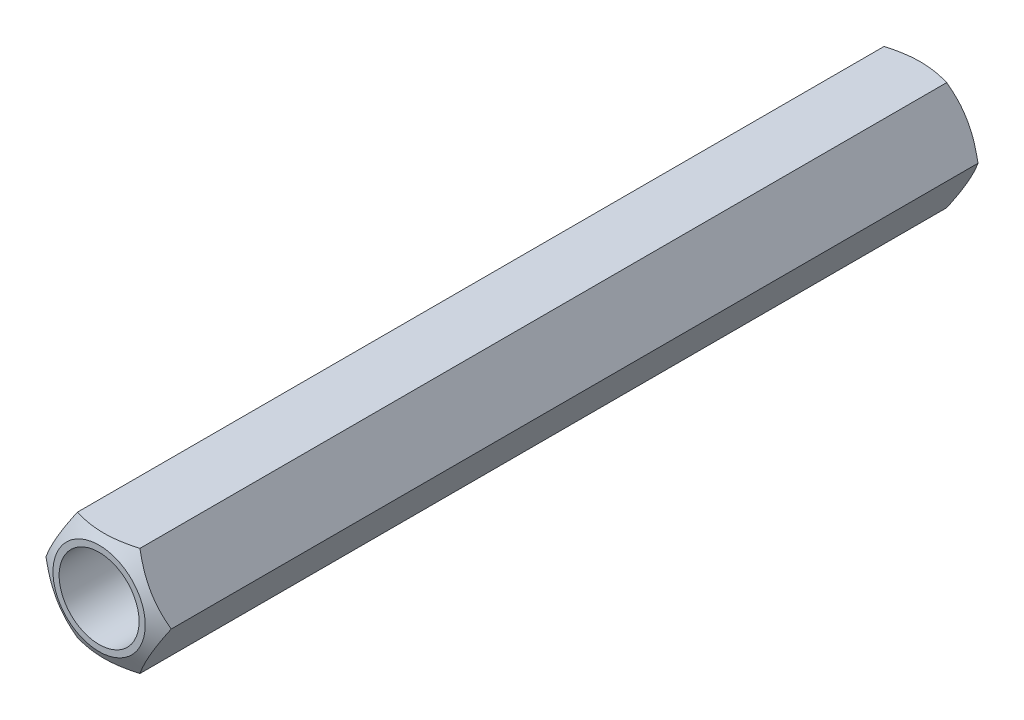
ISO-10303-21;
HEADER;
FILE_DESCRIPTION(('STEP AP214'),'2;1');
FILE_NAME('part.step','',(''),(''),'','','');
FILE_SCHEMA(('AUTOMOTIVE_DESIGN { 1 0 10303 214 1 1 1 1 }'));
ENDSEC;
DATA;
#1=APPLICATION_CONTEXT('core data for automotive mechanical design processes');
#2=APPLICATION_PROTOCOL_DEFINITION('international standard','automotive_design',2000,#1);
#3=PRODUCT_CONTEXT('',#1,'mechanical');
#4=PRODUCT('Part','Part','',(#3));
#5=PRODUCT_RELATED_PRODUCT_CATEGORY('part','',(#4));
#6=PRODUCT_DEFINITION_FORMATION('','',#4);
#7=PRODUCT_DEFINITION_CONTEXT('part definition',#1,'design');
#8=PRODUCT_DEFINITION('design','',#6,#7);
#9=PRODUCT_DEFINITION_SHAPE('','',#8);
#10=(LENGTH_UNIT() NAMED_UNIT(*) SI_UNIT(.MILLI.,.METRE.));
#11=(NAMED_UNIT(*) PLANE_ANGLE_UNIT() SI_UNIT($,.RADIAN.));
#12=(NAMED_UNIT(*) SI_UNIT($,.STERADIAN.) SOLID_ANGLE_UNIT());
#13=UNCERTAINTY_MEASURE_WITH_UNIT(LENGTH_MEASURE(1.E-05),#10,'distance_accuracy_value','');
#14=(GEOMETRIC_REPRESENTATION_CONTEXT(3) GLOBAL_UNCERTAINTY_ASSIGNED_CONTEXT((#13)) GLOBAL_UNIT_ASSIGNED_CONTEXT((#10,
#11,#12)) REPRESENTATION_CONTEXT('',''));
#15=CARTESIAN_POINT('',(0.,0.,0.));
#16=DIRECTION('',(0.,0.,1.));
#17=DIRECTION('',(1.,0.,0.));
#18=AXIS2_PLACEMENT_3D('',#15,#16,#17);
#19=CARTESIAN_POINT('',(0.,0.,31.));
#20=DIRECTION('',(0.,0.,1.));
#21=DIRECTION('',(1.,0.,0.));
#22=AXIS2_PLACEMENT_3D('',#19,#20,#21);
#23=PLANE('',#22);
#24=CARTESIAN_POINT('',(0.,0.,31.));
#25=DIRECTION('',(0.,0.,1.));
#26=DIRECTION('',(1.,0.,0.));
#27=AXIS2_PLACEMENT_3D('',#24,#25,#26);
#28=CIRCLE('',#27,1.5);
#29=CARTESIAN_POINT('',(1.5,0.,31.));
#30=VERTEX_POINT('',#29);
#31=EDGE_CURVE('E231',#30,#30,#28,.T.);
#32=ORIENTED_EDGE('',*,*,#31,.F.);
#33=EDGE_LOOP('',(#32));
#34=FACE_BOUND('',#33,.T.);
#35=CARTESIAN_POINT('',(0.,0.,31.));
#36=DIRECTION('',(0.,0.,1.));
#37=DIRECTION('',(1.,0.,0.));
#38=AXIS2_PLACEMENT_3D('',#35,#36,#37);
#39=CIRCLE('',#38,1.73205080756886);
#40=CARTESIAN_POINT('',(1.73205080756886,0.,31.));
#41=VERTEX_POINT('',#40);
#42=EDGE_CURVE('E118',#41,#41,#39,.F.);
#43=ORIENTED_EDGE('',*,*,#42,.F.);
#44=EDGE_LOOP('',(#43));
#45=FACE_BOUND('',#44,.T.);
#46=ADVANCED_FACE('F54',(#34,#45),#23,.T.);
#47=CARTESIAN_POINT('',(0.,0.,0.));
#48=DIRECTION('',(0.,0.,1.));
#49=DIRECTION('',(1.,0.,0.));
#50=AXIS2_PLACEMENT_3D('',#47,#48,#49);
#51=PLANE('',#50);
#52=CARTESIAN_POINT('',(0.,0.,0.));
#53=DIRECTION('',(0.,0.,1.));
#54=DIRECTION('',(1.,0.,0.));
#55=AXIS2_PLACEMENT_3D('',#52,#53,#54);
#56=CIRCLE('',#55,1.5);
#57=CARTESIAN_POINT('',(1.5,0.,0.));
#58=VERTEX_POINT('',#57);
#59=EDGE_CURVE('E269',#58,#58,#56,.T.);
#60=ORIENTED_EDGE('',*,*,#59,.T.);
#61=EDGE_LOOP('',(#60));
#62=FACE_BOUND('',#61,.T.);
#63=CARTESIAN_POINT('',(0.,0.,0.));
#64=DIRECTION('',(0.,0.,1.));
#65=DIRECTION('',(1.,0.,0.));
#66=AXIS2_PLACEMENT_3D('',#63,#64,#65);
#67=CIRCLE('',#66,1.73205080756886);
#68=CARTESIAN_POINT('',(1.73205080756886,0.,0.));
#69=VERTEX_POINT('',#68);
#70=EDGE_CURVE('E272',#69,#69,#67,.F.);
#71=ORIENTED_EDGE('',*,*,#70,.T.);
#72=EDGE_LOOP('',(#71));
#73=FACE_BOUND('',#72,.T.);
#74=ADVANCED_FACE('F257',(#62,#73),#51,.F.);
#75=CARTESIAN_POINT('',(1.175,-2.03515969889343,31.));
#76=DIRECTION('',(-0.866025403784439,0.499999999999999,0.));
#77=DIRECTION('',(-0.499999999999999,-0.866025403784439,0.));
#78=AXIS2_PLACEMENT_3D('',#75,#76,#77);
#79=PLANE('',#78);
#80=DIRECTION('',(0.,0.,-1.));
#81=VECTOR('',#80,1.);
#82=CARTESIAN_POINT('',(2.35,0.,31.));
#83=LINE('',#82,#81);
#84=CARTESIAN_POINT('',(2.35,0.,30.6432268674044));
#85=VERTEX_POINT('',#84);
#86=CARTESIAN_POINT('',(2.35,0.,0.356773132595634));
#87=VERTEX_POINT('',#86);
#88=EDGE_CURVE('E124',#85,#87,#83,.T.);
#89=ORIENTED_EDGE('',*,*,#88,.F.);
#90=CARTESIAN_POINT('',(2.35011547005384,0.000200000000000434,30.6431601958243));
#91=CARTESIAN_POINT('',(2.2984793873616,-0.0892363187267751,30.6729852942501));
#92=CARTESIAN_POINT('',(2.24639758704351,-0.179444643027371,30.7001104966192));
#93=CARTESIAN_POINT('',(2.14133206603719,-0.361423463534016,30.7474586421103));
#94=CARTESIAN_POINT('',(2.08834647796896,-0.453197194137108,30.7676648337612));
#95=CARTESIAN_POINT('',(1.98303198419037,-0.63560724813502,30.7991198539999));
#96=CARTESIAN_POINT('',(1.9307192858608,-0.726215499522855,30.810578013062));
#97=CARTESIAN_POINT('',(1.8258476400518,-0.907858518337419,30.8242586454905));
#98=CARTESIAN_POINT('',(1.7732890739553,-0.998892625189523,30.826492445513));
#99=CARTESIAN_POINT('',(1.67507381206318,-1.16900644886535,30.8218545292715));
#100=CARTESIAN_POINT('',(1.62940244134637,-1.24811158339818,30.8161215815286));
#101=CARTESIAN_POINT('',(1.53835725987695,-1.40580646348754,30.7979486548651));
#102=CARTESIAN_POINT('',(1.49298376421934,-1.48439566328352,30.7855024632749));
#103=CARTESIAN_POINT('',(1.40175074369061,-1.64241589016727,30.7543868269811));
#104=CARTESIAN_POINT('',(1.35590277051368,-1.72182690913376,30.7355854354951));
#105=CARTESIAN_POINT('',(1.26489078161475,-1.87946429800461,30.6929132404831));
#106=CARTESIAN_POINT('',(1.21972559917134,-1.9576926887297,30.6690524686444));
#107=CARTESIAN_POINT('',(1.17488452994616,-2.03535969889343,30.6431601958243));
#108=B_SPLINE_CURVE_WITH_KNOTS('',3,(#90,#91,#92,#93,#94,#95,#96,#97,#98,#99,#100,#101,#102,
#103,#104,#105,#106,#107),.UNSPECIFIED.,.F.,.F.,(4,2,2,2,2,2,2,2,4),(0.,0.322604918431751,
0.645985456040625,0.961361785082122,1.27635074592414,1.55065702629411,1.82521759589205,
2.10586975684077,2.38597056200365),.UNSPECIFIED.);
#109=CARTESIAN_POINT('',(1.175,-2.03515969889343,30.6432268674044));
#110=VERTEX_POINT('',#109);
#111=EDGE_CURVE('E112',#85,#110,#108,.T.);
#112=ORIENTED_EDGE('',*,*,#111,.T.);
#113=DIRECTION('',(0.,0.,-1.));
#114=VECTOR('',#113,1.);
#115=CARTESIAN_POINT('',(1.175,-2.03515969889343,31.));
#116=LINE('',#115,#114);
#117=CARTESIAN_POINT('',(1.175,-2.03515969889343,0.356773132595635));
#118=VERTEX_POINT('',#117);
#119=EDGE_CURVE('E83',#110,#118,#116,.T.);
#120=ORIENTED_EDGE('',*,*,#119,.T.);
#121=CARTESIAN_POINT('',(1.17488452994616,-2.03535969889343,0.356839804175679));
#122=CARTESIAN_POINT('',(1.2265206126384,-1.94592338016666,0.327014705749918));
#123=CARTESIAN_POINT('',(1.27860241295649,-1.85571505586606,0.299889503380816));
#124=CARTESIAN_POINT('',(1.38366793396281,-1.67373623535942,0.252541357889685));
#125=CARTESIAN_POINT('',(1.43665352203104,-1.58196250475632,0.232335166238845));
#126=CARTESIAN_POINT('',(1.54196801580963,-1.39955245075841,0.200880146000134));
#127=CARTESIAN_POINT('',(1.5942807141392,-1.30894419937058,0.189421986938017));
#128=CARTESIAN_POINT('',(1.6991523599482,-1.12730118055601,0.175741354509481));
#129=CARTESIAN_POINT('',(1.7517109260447,-1.03626707370391,0.173507554486975));
#130=CARTESIAN_POINT('',(1.84992618793682,-0.866153250028083,0.178145470728485));
#131=CARTESIAN_POINT('',(1.89559755865363,-0.787048115495255,0.183878418471439));
#132=CARTESIAN_POINT('',(1.98664274012305,-0.629353235405892,0.202051345134873));
#133=CARTESIAN_POINT('',(2.03201623578065,-0.550764035609908,0.214497536725122));
#134=CARTESIAN_POINT('',(2.12324925630939,-0.392743808726161,0.245613173018903));
#135=CARTESIAN_POINT('',(2.16909722948632,-0.313332789759668,0.264414564504895));
#136=CARTESIAN_POINT('',(2.26010921838525,-0.155695400888821,0.307086759516852));
#137=CARTESIAN_POINT('',(2.30527440082866,-0.0774670101637284,0.330947531355551));
#138=CARTESIAN_POINT('',(2.35011547005384,0.000200000000000554,0.356839804175679));
#139=B_SPLINE_CURVE_WITH_KNOTS('',3,(#121,#122,#123,#124,#125,#126,#127,#128,#129,#130,#131,
#132,#133,#134,#135,#136,#137,#138),.UNSPECIFIED.,.F.,.F.,(4,2,2,2,2,2,2,2,4),(0.,
0.32260491843175,0.645985456040625,0.961361785082122,1.27635074592414,1.55065702629411,
1.82521759589205,2.10586975684077,2.38597056200365),.UNSPECIFIED.);
#140=EDGE_CURVE('E129',#118,#87,#139,.T.);
#141=ORIENTED_EDGE('',*,*,#140,.T.);
#142=EDGE_LOOP('',(#89,#112,#120,#141));
#143=FACE_BOUND('',#142,.T.);
#144=ADVANCED_FACE('F56',(#143),#79,.F.);
#145=CARTESIAN_POINT('',(2.35,0.,31.));
#146=DIRECTION('',(-0.866025403784439,-0.5,0.));
#147=DIRECTION('',(0.5,-0.866025403784439,0.));
#148=AXIS2_PLACEMENT_3D('',#145,#146,#147);
#149=PLANE('',#148);
#150=DIRECTION('',(0.,0.,-1.));
#151=VECTOR('',#150,1.);
#152=CARTESIAN_POINT('',(1.175,2.03515969889343,31.));
#153=LINE('',#152,#151);
#154=CARTESIAN_POINT('',(1.175,2.03515969889343,30.6432268674044));
#155=VERTEX_POINT('',#154);
#156=CARTESIAN_POINT('',(1.175,2.03515969889343,0.356773132595634));
#157=VERTEX_POINT('',#156);
#158=EDGE_CURVE('E126',#155,#157,#153,.T.);
#159=ORIENTED_EDGE('',*,*,#158,.F.);
#160=CARTESIAN_POINT('',(1.17488452994616,2.03535969889343,30.6431601958243));
#161=CARTESIAN_POINT('',(1.22652061263839,1.94592338016666,30.6729852942501));
#162=CARTESIAN_POINT('',(1.27860241295649,1.85571505586606,30.7001104966192));
#163=CARTESIAN_POINT('',(1.38366793396281,1.67373623535941,30.7474586421103));
#164=CARTESIAN_POINT('',(1.43665352203104,1.58196250475632,30.7676648337612));
#165=CARTESIAN_POINT('',(1.54196801580963,1.39955245075841,30.7991198539999));
#166=CARTESIAN_POINT('',(1.5942807141392,1.30894419937058,30.810578013062));
#167=CARTESIAN_POINT('',(1.6991523599482,1.12730118055601,30.8242586454905));
#168=CARTESIAN_POINT('',(1.7517109260447,1.03626707370391,30.826492445513));
#169=CARTESIAN_POINT('',(1.84992618793682,0.866153250028082,30.8218545292715));
#170=CARTESIAN_POINT('',(1.89559755865363,0.787048115495254,30.8161215815286));
#171=CARTESIAN_POINT('',(1.98664274012305,0.629353235405891,30.7979486548651));
#172=CARTESIAN_POINT('',(2.03201623578065,0.550764035609908,30.7855024632749));
#173=CARTESIAN_POINT('',(2.12324925630939,0.392743808726161,30.7543868269811));
#174=CARTESIAN_POINT('',(2.16909722948632,0.313332789759668,30.7355854354951));
#175=CARTESIAN_POINT('',(2.26010921838525,0.155695400888822,30.6929132404831));
#176=CARTESIAN_POINT('',(2.30527440082866,0.0774670101637288,30.6690524686444));
#177=CARTESIAN_POINT('',(2.35011547005384,-0.000199999999999918,30.6431601958243));
#178=B_SPLINE_CURVE_WITH_KNOTS('',3,(#160,#161,#162,#163,#164,#165,#166,#167,#168,#169,#170,
#171,#172,#173,#174,#175,#176,#177),.UNSPECIFIED.,.F.,.F.,(4,2,2,2,2,2,2,2,4),(0.,
0.322604918431751,0.645985456040625,0.961361785082122,1.27635074592414,1.55065702629411,
1.82521759589205,2.10586975684077,2.38597056200365),.UNSPECIFIED.);
#179=EDGE_CURVE('E115',#155,#85,#178,.T.);
#180=ORIENTED_EDGE('',*,*,#179,.T.);
#181=ORIENTED_EDGE('',*,*,#88,.T.);
#182=CARTESIAN_POINT('',(2.35011547005384,-0.000199999999999566,0.356839804175679));
#183=CARTESIAN_POINT('',(2.2984793873616,0.0892363187267756,0.327014705749916));
#184=CARTESIAN_POINT('',(2.24639758704351,0.179444643027371,0.299889503380814));
#185=CARTESIAN_POINT('',(2.14133206603719,0.361423463534017,0.252541357889684));
#186=CARTESIAN_POINT('',(2.08834647796896,0.453197194137109,0.232335166238844));
#187=CARTESIAN_POINT('',(1.98303198419037,0.63560724813502,0.200880146000134));
#188=CARTESIAN_POINT('',(1.9307192858608,0.726215499522856,0.189421986938016));
#189=CARTESIAN_POINT('',(1.8258476400518,0.907858518337419,0.175741354509481));
#190=CARTESIAN_POINT('',(1.7732890739553,0.998892625189523,0.173507554486975));
#191=CARTESIAN_POINT('',(1.67507381206318,1.16900644886535,0.178145470728485));
#192=CARTESIAN_POINT('',(1.62940244134637,1.24811158339818,0.183878418471439));
#193=CARTESIAN_POINT('',(1.53835725987695,1.40580646348754,0.202051345134873));
#194=CARTESIAN_POINT('',(1.49298376421934,1.48439566328352,0.214497536725122));
#195=CARTESIAN_POINT('',(1.40175074369061,1.64241589016727,0.245613173018903));
#196=CARTESIAN_POINT('',(1.35590277051368,1.72182690913376,0.264414564504896));
#197=CARTESIAN_POINT('',(1.26489078161475,1.87946429800461,0.307086759516853));
#198=CARTESIAN_POINT('',(1.21972559917134,1.9576926887297,0.330947531355552));
#199=CARTESIAN_POINT('',(1.17488452994616,2.03535969889343,0.356839804175679));
#200=B_SPLINE_CURVE_WITH_KNOTS('',3,(#182,#183,#184,#185,#186,#187,#188,#189,#190,#191,#192,
#193,#194,#195,#196,#197,#198,#199),.UNSPECIFIED.,.F.,.F.,(4,2,2,2,2,2,2,2,4),(0.,
0.32260491843175,0.645985456040625,0.961361785082122,1.27635074592414,1.55065702629411,
1.82521759589205,2.10586975684077,2.38597056200365),.UNSPECIFIED.);
#201=EDGE_CURVE('E180',#87,#157,#200,.T.);
#202=ORIENTED_EDGE('',*,*,#201,.T.);
#203=EDGE_LOOP('',(#159,#180,#181,#202));
#204=FACE_BOUND('',#203,.T.);
#205=ADVANCED_FACE('F122',(#204),#149,.F.);
#206=CARTESIAN_POINT('',(1.175,2.03515969889343,31.));
#207=DIRECTION('',(0.,-1.,0.));
#208=DIRECTION('',(0.,0.,-1.));
#209=AXIS2_PLACEMENT_3D('',#206,#207,#208);
#210=PLANE('',#209);
#211=DIRECTION('',(0.,0.,-1.));
#212=VECTOR('',#211,1.);
#213=CARTESIAN_POINT('',(-1.175,2.03515969889343,31.));
#214=LINE('',#213,#212);
#215=CARTESIAN_POINT('',(-1.175,2.03515969889343,30.6432268674044));
#216=VERTEX_POINT('',#215);
#217=CARTESIAN_POINT('',(-1.175,2.03515969889343,0.356773132595634));
#218=VERTEX_POINT('',#217);
#219=EDGE_CURVE('E132',#216,#218,#214,.T.);
#220=ORIENTED_EDGE('',*,*,#219,.F.);
#221=CARTESIAN_POINT('',(-3.55212807382598,2.03515969889343,29.6364229895585));
#222=CARTESIAN_POINT('',(-3.467231219555,2.03515969889343,29.6789457863061));
#223=CARTESIAN_POINT('',(-3.38218735213429,2.03515969889343,29.7211781261118));
#224=CARTESIAN_POINT('',(-3.21174137339139,2.03515969889343,29.8049199216354));
#225=CARTESIAN_POINT('',(-3.12633925087882,2.03515969889343,29.846429354561));
#226=CARTESIAN_POINT('',(-2.95494695090238,2.03515969889343,29.9286626827804));
#227=CARTESIAN_POINT('',(-2.8689559397785,2.03515969889343,29.9693848442058));
#228=CARTESIAN_POINT('',(-2.69647511164815,2.03515969889343,30.0497642087398));
#229=CARTESIAN_POINT('',(-2.60998528715122,2.03515969889343,30.0894213958053));
#230=CARTESIAN_POINT('',(-2.43247722602007,2.03515969889343,30.1691919677778));
#231=CARTESIAN_POINT('',(-2.34143153149365,2.03515969889343,30.2092444542354));
#232=CARTESIAN_POINT('',(-2.15856753427552,2.03515969889343,30.287543134664));
#233=CARTESIAN_POINT('',(-2.06674925847243,2.03515969889343,30.3257893911944));
#234=CARTESIAN_POINT('',(-1.88225615012745,2.03515969889343,30.3999603781493));
#235=CARTESIAN_POINT('',(-1.78958203248994,2.03515969889343,30.4358868755508));
#236=CARTESIAN_POINT('',(-1.60311772523511,2.03515969889343,30.5048151850297));
#237=CARTESIAN_POINT('',(-1.50932723392549,2.03515969889343,30.5378161851776));
#238=CARTESIAN_POINT('',(-1.29865551841119,2.03515969889343,30.6072500230001));
#239=CARTESIAN_POINT('',(-1.1814486086403,2.03515969889343,30.6427125951554));
#240=CARTESIAN_POINT('',(-0.94499747792175,2.03515969889343,30.7059183917756));
#241=CARTESIAN_POINT('',(-0.825754492729689,2.03515969889343,30.7336661334005));
#242=CARTESIAN_POINT('',(-0.587339057991055,2.03515969889343,30.7787427670454));
#243=CARTESIAN_POINT('',(-0.468199369521763,2.03515969889343,30.7962395637091));
#244=CARTESIAN_POINT('',(-0.228789198584628,2.03515969889343,30.8195559550923));
#245=CARTESIAN_POINT('',(-0.108519231404826,2.03515969889343,30.8253806340986));
#246=CARTESIAN_POINT('',(0.1327376126842,2.03515969889343,30.8245778091304));
#247=CARTESIAN_POINT('',(0.253724221793553,2.03515969889343,30.8178714558971));
#248=CARTESIAN_POINT('',(0.494483203307689,2.03515969889343,30.7927552437889));
#249=CARTESIAN_POINT('',(0.614254982207438,2.03515969889343,30.7743399202169));
#250=CARTESIAN_POINT('',(0.853895389265485,2.03515969889343,30.727463361611));
#251=CARTESIAN_POINT('',(0.973730246544128,2.03515969889343,30.6988347769264));
#252=CARTESIAN_POINT('',(1.21134369999292,2.03515969889343,30.6339539374632));
#253=CARTESIAN_POINT('',(1.32912107782633,2.03515969889343,30.5976973211126));
#254=CARTESIAN_POINT('',(1.53888373245774,2.03515969889343,30.5275523502834));
#255=CARTESIAN_POINT('',(1.63121997250118,2.03515969889343,30.4946948565768));
#256=CARTESIAN_POINT('',(1.81482042687637,2.03515969889343,30.4261984317087));
#257=CARTESIAN_POINT('',(1.90608493043756,2.03515969889343,30.3905602717803));
#258=CARTESIAN_POINT('',(2.17868410029617,2.03515969889343,30.2803504601926));
#259=CARTESIAN_POINT('',(2.35869909190072,2.03515969889343,30.2025273263047));
#260=CARTESIAN_POINT('',(2.70858785977847,2.03515969889343,30.044923983301));
#261=CARTESIAN_POINT('',(2.87856563694111,2.03515969889343,29.9653705612985));
#262=CARTESIAN_POINT('',(3.13216617732772,2.03515969889343,29.8436016148447));
#263=CARTESIAN_POINT('',(3.2163958374263,2.03515969889343,29.8026439429527));
#264=CARTESIAN_POINT('',(3.38450762339114,2.03515969889343,29.7200269984123));
#265=CARTESIAN_POINT('',(3.46838975905389,2.03515969889343,29.678367745711));
#266=CARTESIAN_POINT('',(3.55212807382598,2.03515969889343,29.6364229895585));
#267=B_SPLINE_CURVE_WITH_KNOTS('',3,(#221,#222,#223,#224,#225,#226,#227,#228,#229,#230,#231,
#232,#233,#234,#235,#236,#237,#238,#239,#240,#241,#242,#243,#244,#245,#246,#247,#248,#249,#250,
#251,#252,#253,#254,#255,#256,#257,#258,#259,#260,#261,#262,#263,#264,#265,#266),.UNSPECIFIED.,
.F.,.F.,(4,2,2,2,2,2,2,2,2,2,2,2,2,2,2,2,2,2,2,2,2,2,4),(0.,0.284854034167145,0.569717033230054,
0.855148786881762,1.14058483795235,1.43896788187757,1.73734058360208,2.03548326430984,
2.33370843286085,2.7008754277329,3.06782698537881,3.42858669368673,3.78918922358478,
4.15206842412695,4.51511710857029,4.88441053752839,5.25391569853288,5.54788939774095,
5.84178184960495,6.42996461167388,6.99294144929101,7.27391803990018,7.55488665532306),.UNSPECIFIED.);
#268=EDGE_CURVE('E127',#216,#155,#267,.T.);
#269=ORIENTED_EDGE('',*,*,#268,.T.);
#270=ORIENTED_EDGE('',*,*,#158,.T.);
#271=CARTESIAN_POINT('',(3.55212807382598,2.03515969889343,1.36357701044152));
#272=CARTESIAN_POINT('',(3.467231219555,2.03515969889343,1.32105421369391));
#273=CARTESIAN_POINT('',(3.38218735213429,2.03515969889343,1.27882187388823));
#274=CARTESIAN_POINT('',(3.21174137339139,2.03515969889343,1.19508007836461));
#275=CARTESIAN_POINT('',(3.12633925087882,2.03515969889343,1.15357064543905));
#276=CARTESIAN_POINT('',(2.95494695090238,2.03515969889343,1.07133731721957));
#277=CARTESIAN_POINT('',(2.8689559397785,2.03515969889343,1.03061515579418));
#278=CARTESIAN_POINT('',(2.69647511164815,2.03515969889343,0.950235791260199));
#279=CARTESIAN_POINT('',(2.60998528715122,2.03515969889343,0.9105786041947));
#280=CARTESIAN_POINT('',(2.43247722602007,2.03515969889343,0.830808032222248));
#281=CARTESIAN_POINT('',(2.34143153149364,2.03515969889343,0.790755545764571));
#282=CARTESIAN_POINT('',(2.15856753427552,2.03515969889343,0.712456865335957));
#283=CARTESIAN_POINT('',(2.06674925847243,2.03515969889343,0.674210608805561));
#284=CARTESIAN_POINT('',(1.88225615012745,2.03515969889343,0.60003962185067));
#285=CARTESIAN_POINT('',(1.78958203248994,2.03515969889343,0.56411312444923));
#286=CARTESIAN_POINT('',(1.60311772523511,2.03515969889343,0.49518481497026));
#287=CARTESIAN_POINT('',(1.50932723392549,2.03515969889343,0.462183814822449));
#288=CARTESIAN_POINT('',(1.29865551841119,2.03515969889343,0.392749976999917));
#289=CARTESIAN_POINT('',(1.1814486086403,2.03515969889343,0.357287404844623));
#290=CARTESIAN_POINT('',(0.944997477921749,2.03515969889343,0.294081608224424));
#291=CARTESIAN_POINT('',(0.825754492729689,2.03515969889343,0.266333866599506));
#292=CARTESIAN_POINT('',(0.587339057991054,2.03515969889343,0.221257232954636));
#293=CARTESIAN_POINT('',(0.468199369521762,2.03515969889343,0.203760436290865));
#294=CARTESIAN_POINT('',(0.228789198584627,2.03515969889343,0.180444044907698));
#295=CARTESIAN_POINT('',(0.108519231404825,2.03515969889343,0.17461936590145));
#296=CARTESIAN_POINT('',(-0.132737612684202,2.03515969889343,0.175422190869629));
#297=CARTESIAN_POINT('',(-0.253724221793555,2.03515969889343,0.182128544102923));
#298=CARTESIAN_POINT('',(-0.494483203307691,2.03515969889343,0.207244756211094));
#299=CARTESIAN_POINT('',(-0.614254982207439,2.03515969889343,0.225660079783118));
#300=CARTESIAN_POINT('',(-0.853895389265486,2.03515969889343,0.272536638388956));
#301=CARTESIAN_POINT('',(-0.973730246544129,2.03515969889343,0.301165223073566));
#302=CARTESIAN_POINT('',(-1.21134369999292,2.03515969889343,0.366046062536759));
#303=CARTESIAN_POINT('',(-1.32912107782633,2.03515969889343,0.402302678887387));
#304=CARTESIAN_POINT('',(-1.53888373245774,2.03515969889343,0.472447649716588));
#305=CARTESIAN_POINT('',(-1.63121997250118,2.03515969889343,0.505305143423232));
#306=CARTESIAN_POINT('',(-1.81482042687637,2.03515969889343,0.5738015682913));
#307=CARTESIAN_POINT('',(-1.90608493043756,2.03515969889343,0.609439728219734));
#308=CARTESIAN_POINT('',(-2.17868410029616,2.03515969889343,0.719649539807435));
#309=CARTESIAN_POINT('',(-2.35869909190072,2.03515969889343,0.797472673695334));
#310=CARTESIAN_POINT('',(-2.70858785977847,2.03515969889343,0.955076016698999));
#311=CARTESIAN_POINT('',(-2.87856563694111,2.03515969889343,1.03462943870146));
#312=CARTESIAN_POINT('',(-3.13216617732772,2.03515969889343,1.15639838515525));
#313=CARTESIAN_POINT('',(-3.2163958374263,2.03515969889343,1.19735605704728));
#314=CARTESIAN_POINT('',(-3.38450762339114,2.03515969889343,1.27997300158771));
#315=CARTESIAN_POINT('',(-3.46838975905389,2.03515969889343,1.32163225428902));
#316=CARTESIAN_POINT('',(-3.55212807382599,2.03515969889343,1.36357701044152));
#317=B_SPLINE_CURVE_WITH_KNOTS('',3,(#271,#272,#273,#274,#275,#276,#277,#278,#279,#280,#281,
#282,#283,#284,#285,#286,#287,#288,#289,#290,#291,#292,#293,#294,#295,#296,#297,#298,#299,#300,
#301,#302,#303,#304,#305,#306,#307,#308,#309,#310,#311,#312,#313,#314,#315,#316),.UNSPECIFIED.,
.F.,.F.,(4,2,2,2,2,2,2,2,2,2,2,2,2,2,2,2,2,2,2,2,2,2,4),(0.,0.284854034167145,0.569717033230055,
0.855148786881763,1.14058483795235,1.43896788187757,1.73734058360209,2.03548326430984,
2.33370843286085,2.7008754277329,3.06782698537881,3.42858669368673,3.78918922358478,
4.15206842412695,4.51511710857029,4.88441053752839,5.25391569853288,5.54788939774095,
5.84178184960495,6.42996461167387,6.992941449291,7.27391803990018,7.55488665532306),.UNSPECIFIED.);
#318=EDGE_CURVE('E173',#157,#218,#317,.T.);
#319=ORIENTED_EDGE('',*,*,#318,.T.);
#320=EDGE_LOOP('',(#220,#269,#270,#319));
#321=FACE_BOUND('',#320,.T.);
#322=ADVANCED_FACE('F192',(#321),#210,.F.);
#323=CARTESIAN_POINT('',(-1.175,2.03515969889343,31.));
#324=DIRECTION('',(0.866025403784439,-0.5,0.));
#325=DIRECTION('',(0.5,0.866025403784439,0.));
#326=AXIS2_PLACEMENT_3D('',#323,#324,#325);
#327=PLANE('',#326);
#328=DIRECTION('',(0.,0.,-1.));
#329=VECTOR('',#328,1.);
#330=CARTESIAN_POINT('',(-2.35,0.,31.));
#331=LINE('',#330,#329);
#332=CARTESIAN_POINT('',(-2.35,0.,30.6432268674044));
#333=VERTEX_POINT('',#332);
#334=CARTESIAN_POINT('',(-2.35,0.,0.356773132595634));
#335=VERTEX_POINT('',#334);
#336=EDGE_CURVE('E228',#333,#335,#331,.T.);
#337=ORIENTED_EDGE('',*,*,#336,.F.);
#338=CARTESIAN_POINT('',(-2.35011547005384,-0.000200000000001301,30.6431601958243));
#339=CARTESIAN_POINT('',(-2.29847938736161,0.0892363187267741,30.6729852942501));
#340=CARTESIAN_POINT('',(-2.24639758704351,0.17944464302737,30.7001104966192));
#341=CARTESIAN_POINT('',(-2.14133206603719,0.361423463534015,30.7474586421103));
#342=CARTESIAN_POINT('',(-2.08834647796896,0.453197194137107,30.7676648337612));
#343=CARTESIAN_POINT('',(-1.98303198419037,0.635607248135019,30.7991198539999));
#344=CARTESIAN_POINT('',(-1.9307192858608,0.726215499522854,30.810578013062));
#345=CARTESIAN_POINT('',(-1.8258476400518,0.907858518337418,30.8242586454905));
#346=CARTESIAN_POINT('',(-1.7732890739553,0.998892625189522,30.826492445513));
#347=CARTESIAN_POINT('',(-1.67507381206318,1.16900644886535,30.8218545292715));
#348=CARTESIAN_POINT('',(-1.62940244134637,1.24811158339818,30.8161215815286));
#349=CARTESIAN_POINT('',(-1.53835725987695,1.40580646348754,30.7979486548651));
#350=CARTESIAN_POINT('',(-1.49298376421935,1.48439566328352,30.7855024632749));
#351=CARTESIAN_POINT('',(-1.40175074369061,1.64241589016727,30.7543868269811));
#352=CARTESIAN_POINT('',(-1.35590277051368,1.72182690913376,30.7355854354951));
#353=CARTESIAN_POINT('',(-1.26489078161475,1.87946429800461,30.6929132404831));
#354=CARTESIAN_POINT('',(-1.21972559917134,1.9576926887297,30.6690524686444));
#355=CARTESIAN_POINT('',(-1.17488452994616,2.03535969889343,30.6431601958243));
#356=B_SPLINE_CURVE_WITH_KNOTS('',3,(#338,#339,#340,#341,#342,#343,#344,#345,#346,#347,#348,
#349,#350,#351,#352,#353,#354,#355),.UNSPECIFIED.,.F.,.F.,(4,2,2,2,2,2,2,2,4),(0.,
0.32260491843175,0.645985456040626,0.961361785082122,1.27635074592414,1.55065702629411,
1.82521759589205,2.10586975684077,2.38597056200365),.UNSPECIFIED.);
#357=EDGE_CURVE('E236',#333,#216,#356,.T.);
#358=ORIENTED_EDGE('',*,*,#357,.T.);
#359=ORIENTED_EDGE('',*,*,#219,.T.);
#360=CARTESIAN_POINT('',(-1.17488452994616,2.03535969889343,0.356839804175679));
#361=CARTESIAN_POINT('',(-1.2265206126384,1.94592338016666,0.327014705749917));
#362=CARTESIAN_POINT('',(-1.27860241295649,1.85571505586606,0.299889503380815));
#363=CARTESIAN_POINT('',(-1.38366793396281,1.67373623535941,0.252541357889684));
#364=CARTESIAN_POINT('',(-1.43665352203104,1.58196250475632,0.232335166238844));
#365=CARTESIAN_POINT('',(-1.54196801580963,1.39955245075841,0.200880146000134));
#366=CARTESIAN_POINT('',(-1.5942807141392,1.30894419937058,0.189421986938017));
#367=CARTESIAN_POINT('',(-1.6991523599482,1.12730118055601,0.175741354509481));
#368=CARTESIAN_POINT('',(-1.7517109260447,1.03626707370391,0.173507554486975));
#369=CARTESIAN_POINT('',(-1.84992618793682,0.866153250028082,0.178145470728485));
#370=CARTESIAN_POINT('',(-1.89559755865363,0.787048115495254,0.183878418471439));
#371=CARTESIAN_POINT('',(-1.98664274012305,0.629353235405891,0.202051345134873));
#372=CARTESIAN_POINT('',(-2.03201623578066,0.550764035609907,0.214497536725123));
#373=CARTESIAN_POINT('',(-2.12324925630939,0.39274380872616,0.245613173018903));
#374=CARTESIAN_POINT('',(-2.16909722948632,0.313332789759667,0.264414564504896));
#375=CARTESIAN_POINT('',(-2.26010921838525,0.155695400888821,0.307086759516853));
#376=CARTESIAN_POINT('',(-2.30527440082866,0.0774670101637276,0.330947531355552));
#377=CARTESIAN_POINT('',(-2.35011547005384,-0.000200000000001378,0.356839804175679));
#378=B_SPLINE_CURVE_WITH_KNOTS('',3,(#360,#361,#362,#363,#364,#365,#366,#367,#368,#369,#370,
#371,#372,#373,#374,#375,#376,#377),.UNSPECIFIED.,.F.,.F.,(4,2,2,2,2,2,2,2,4),(0.,
0.322604918431751,0.645985456040625,0.961361785082122,1.27635074592414,1.55065702629411,
1.82521759589205,2.10586975684077,2.38597056200365),.UNSPECIFIED.);
#379=EDGE_CURVE('E166',#218,#335,#378,.T.);
#380=ORIENTED_EDGE('',*,*,#379,.T.);
#381=EDGE_LOOP('',(#337,#358,#359,#380));
#382=FACE_BOUND('',#381,.T.);
#383=ADVANCED_FACE('F235',(#382),#327,.F.);
#384=CARTESIAN_POINT('',(-2.35,0.,31.));
#385=DIRECTION('',(0.866025403784439,0.5,0.));
#386=DIRECTION('',(-0.5,0.866025403784439,0.));
#387=AXIS2_PLACEMENT_3D('',#384,#385,#386);
#388=PLANE('',#387);
#389=DIRECTION('',(0.,0.,-1.));
#390=VECTOR('',#389,1.);
#391=CARTESIAN_POINT('',(-1.175,-2.03515969889343,31.));
#392=LINE('',#391,#390);
#393=CARTESIAN_POINT('',(-1.175,-2.03515969889343,30.6432268674044));
#394=VERTEX_POINT('',#393);
#395=CARTESIAN_POINT('',(-1.175,-2.03515969889343,0.356773132595634));
#396=VERTEX_POINT('',#395);
#397=EDGE_CURVE('E227',#394,#396,#392,.T.);
#398=ORIENTED_EDGE('',*,*,#397,.F.);
#399=CARTESIAN_POINT('',(-1.17488452994616,-2.03535969889343,30.6431601958243));
#400=CARTESIAN_POINT('',(-1.2265206126384,-1.94592338016666,30.6729852942501));
#401=CARTESIAN_POINT('',(-1.27860241295649,-1.85571505586606,30.7001104966192));
#402=CARTESIAN_POINT('',(-1.38366793396281,-1.67373623535941,30.7474586421103));
#403=CARTESIAN_POINT('',(-1.43665352203104,-1.58196250475632,30.7676648337612));
#404=CARTESIAN_POINT('',(-1.54196801580963,-1.39955245075841,30.7991198539999));
#405=CARTESIAN_POINT('',(-1.5942807141392,-1.30894419937058,30.810578013062));
#406=CARTESIAN_POINT('',(-1.6991523599482,-1.12730118055601,30.8242586454905));
#407=CARTESIAN_POINT('',(-1.7517109260447,-1.03626707370391,30.826492445513));
#408=CARTESIAN_POINT('',(-1.84992618793682,-0.866153250028083,30.8218545292715));
#409=CARTESIAN_POINT('',(-1.89559755865363,-0.787048115495255,30.8161215815286));
#410=CARTESIAN_POINT('',(-1.98664274012305,-0.629353235405892,30.7979486548651));
#411=CARTESIAN_POINT('',(-2.03201623578066,-0.550764035609908,30.7855024632749));
#412=CARTESIAN_POINT('',(-2.12324925630939,-0.392743808726162,30.7543868269811));
#413=CARTESIAN_POINT('',(-2.16909722948632,-0.313332789759669,30.7355854354951));
#414=CARTESIAN_POINT('',(-2.26010921838525,-0.155695400888823,30.6929132404831));
#415=CARTESIAN_POINT('',(-2.30527440082866,-0.0774670101637299,30.6690524686444));
#416=CARTESIAN_POINT('',(-2.35011547005384,0.000199999999998835,30.6431601958243));
#417=B_SPLINE_CURVE_WITH_KNOTS('',3,(#399,#400,#401,#402,#403,#404,#405,#406,#407,#408,#409,
#410,#411,#412,#413,#414,#415,#416),.UNSPECIFIED.,.F.,.F.,(4,2,2,2,2,2,2,2,4),(0.,
0.322604918431751,0.645985456040626,0.961361785082123,1.27635074592414,1.55065702629411,
1.82521759589205,2.10586975684077,2.38597056200365),.UNSPECIFIED.);
#418=EDGE_CURVE('E76',#394,#333,#417,.T.);
#419=ORIENTED_EDGE('',*,*,#418,.T.);
#420=ORIENTED_EDGE('',*,*,#336,.T.);
#421=CARTESIAN_POINT('',(-2.35011547005384,0.000199999999998699,0.356839804175679));
#422=CARTESIAN_POINT('',(-2.29847938736161,-0.0892363187267767,0.327014705749917));
#423=CARTESIAN_POINT('',(-2.24639758704351,-0.179444643027372,0.299889503380815));
#424=CARTESIAN_POINT('',(-2.14133206603719,-0.361423463534018,0.252541357889684));
#425=CARTESIAN_POINT('',(-2.08834647796896,-0.45319719413711,0.232335166238844));
#426=CARTESIAN_POINT('',(-1.98303198419037,-0.635607248135021,0.200880146000134));
#427=CARTESIAN_POINT('',(-1.9307192858608,-0.726215499522857,0.189421986938017));
#428=CARTESIAN_POINT('',(-1.8258476400518,-0.90785851833742,0.175741354509482));
#429=CARTESIAN_POINT('',(-1.7732890739553,-0.998892625189524,0.173507554486976));
#430=CARTESIAN_POINT('',(-1.67507381206318,-1.16900644886535,0.178145470728486));
#431=CARTESIAN_POINT('',(-1.62940244134637,-1.24811158339818,0.18387841847144));
#432=CARTESIAN_POINT('',(-1.53835725987695,-1.40580646348754,0.202051345134874));
#433=CARTESIAN_POINT('',(-1.49298376421935,-1.48439566328352,0.214497536725123));
#434=CARTESIAN_POINT('',(-1.40175074369061,-1.64241589016727,0.245613173018904));
#435=CARTESIAN_POINT('',(-1.35590277051368,-1.72182690913376,0.264414564504896));
#436=CARTESIAN_POINT('',(-1.26489078161475,-1.87946429800461,0.307086759516853));
#437=CARTESIAN_POINT('',(-1.21972559917135,-1.9576926887297,0.330947531355552));
#438=CARTESIAN_POINT('',(-1.17488452994616,-2.03535969889343,0.356839804175679));
#439=B_SPLINE_CURVE_WITH_KNOTS('',3,(#421,#422,#423,#424,#425,#426,#427,#428,#429,#430,#431,
#432,#433,#434,#435,#436,#437,#438),.UNSPECIFIED.,.F.,.F.,(4,2,2,2,2,2,2,2,4),(0.,
0.32260491843175,0.645985456040625,0.961361785082122,1.27635074592414,1.55065702629411,
1.82521759589205,2.10586975684077,2.38597056200364),.UNSPECIFIED.);
#440=EDGE_CURVE('E158',#335,#396,#439,.T.);
#441=ORIENTED_EDGE('',*,*,#440,.T.);
#442=EDGE_LOOP('',(#398,#419,#420,#441));
#443=FACE_BOUND('',#442,.T.);
#444=ADVANCED_FACE('F248',(#443),#388,.F.);
#445=CARTESIAN_POINT('',(-1.175,-2.03515969889343,31.));
#446=DIRECTION('',(0.,1.,0.));
#447=DIRECTION('',(-1.,0.,0.));
#448=AXIS2_PLACEMENT_3D('',#445,#446,#447);
#449=PLANE('',#448);
#450=ORIENTED_EDGE('',*,*,#119,.F.);
#451=CARTESIAN_POINT('',(3.55212807382599,-2.03515969889343,29.6364229895585));
#452=CARTESIAN_POINT('',(3.467231219555,-2.03515969889343,29.6789457863061));
#453=CARTESIAN_POINT('',(3.38218735213429,-2.03515969889343,29.7211781261118));
#454=CARTESIAN_POINT('',(3.21174137339139,-2.03515969889343,29.8049199216354));
#455=CARTESIAN_POINT('',(3.12633925087882,-2.03515969889343,29.846429354561));
#456=CARTESIAN_POINT('',(2.95494695090238,-2.03515969889343,29.9286626827804));
#457=CARTESIAN_POINT('',(2.8689559397785,-2.03515969889343,29.9693848442058));
#458=CARTESIAN_POINT('',(2.69647511164815,-2.03515969889343,30.0497642087398));
#459=CARTESIAN_POINT('',(2.60998528715122,-2.03515969889343,30.0894213958053));
#460=CARTESIAN_POINT('',(2.43247722602007,-2.03515969889343,30.1691919677778));
#461=CARTESIAN_POINT('',(2.34143153149364,-2.03515969889343,30.2092444542354));
#462=CARTESIAN_POINT('',(2.15856753427552,-2.03515969889343,30.287543134664));
#463=CARTESIAN_POINT('',(2.06674925847243,-2.03515969889343,30.3257893911944));
#464=CARTESIAN_POINT('',(1.88225615012745,-2.03515969889343,30.3999603781493));
#465=CARTESIAN_POINT('',(1.78958203248994,-2.03515969889343,30.4358868755508));
#466=CARTESIAN_POINT('',(1.60311772523511,-2.03515969889343,30.5048151850297));
#467=CARTESIAN_POINT('',(1.50932723392549,-2.03515969889343,30.5378161851776));
#468=CARTESIAN_POINT('',(1.29865551841119,-2.03515969889343,30.6072500230001));
#469=CARTESIAN_POINT('',(1.1814486086403,-2.03515969889343,30.6427125951554));
#470=CARTESIAN_POINT('',(0.944997477921749,-2.03515969889343,30.7059183917756));
#471=CARTESIAN_POINT('',(0.825754492729689,-2.03515969889343,30.7336661334005));
#472=CARTESIAN_POINT('',(0.587339057991054,-2.03515969889343,30.7787427670454));
#473=CARTESIAN_POINT('',(0.468199369521761,-2.03515969889343,30.7962395637091));
#474=CARTESIAN_POINT('',(0.228789198584626,-2.03515969889343,30.8195559550923));
#475=CARTESIAN_POINT('',(0.108519231404824,-2.03515969889343,30.8253806340985));
#476=CARTESIAN_POINT('',(-0.132737612684203,-2.03515969889343,30.8245778091304));
#477=CARTESIAN_POINT('',(-0.253724221793556,-2.03515969889343,30.8178714558971));
#478=CARTESIAN_POINT('',(-0.494483203307692,-2.03515969889343,30.7927552437889));
#479=CARTESIAN_POINT('',(-0.614254982207441,-2.03515969889343,30.7743399202169));
#480=CARTESIAN_POINT('',(-0.853895389265488,-2.03515969889343,30.727463361611));
#481=CARTESIAN_POINT('',(-0.973730246544131,-2.03515969889343,30.6988347769264));
#482=CARTESIAN_POINT('',(-1.21134369999292,-2.03515969889343,30.6339539374632));
#483=CARTESIAN_POINT('',(-1.32912107782634,-2.03515969889343,30.5976973211126));
#484=CARTESIAN_POINT('',(-1.53888373245774,-2.03515969889343,30.5275523502834));
#485=CARTESIAN_POINT('',(-1.63121997250118,-2.03515969889343,30.4946948565768));
#486=CARTESIAN_POINT('',(-1.81482042687638,-2.03515969889343,30.4261984317087));
#487=CARTESIAN_POINT('',(-1.90608493043756,-2.03515969889343,30.3905602717803));
#488=CARTESIAN_POINT('',(-2.17868410029617,-2.03515969889343,30.2803504601926));
#489=CARTESIAN_POINT('',(-2.35869909190072,-2.03515969889343,30.2025273263047));
#490=CARTESIAN_POINT('',(-2.70858785977847,-2.03515969889343,30.044923983301));
#491=CARTESIAN_POINT('',(-2.87856563694111,-2.03515969889343,29.9653705612985));
#492=CARTESIAN_POINT('',(-3.13216617732772,-2.03515969889343,29.8436016148447));
#493=CARTESIAN_POINT('',(-3.2163958374263,-2.03515969889343,29.8026439429527));
#494=CARTESIAN_POINT('',(-3.38450762339114,-2.03515969889343,29.7200269984123));
#495=CARTESIAN_POINT('',(-3.46838975905389,-2.03515969889343,29.678367745711));
#496=CARTESIAN_POINT('',(-3.55212807382599,-2.03515969889343,29.6364229895585));
#497=B_SPLINE_CURVE_WITH_KNOTS('',3,(#451,#452,#453,#454,#455,#456,#457,#458,#459,#460,#461,
#462,#463,#464,#465,#466,#467,#468,#469,#470,#471,#472,#473,#474,#475,#476,#477,#478,#479,#480,
#481,#482,#483,#484,#485,#486,#487,#488,#489,#490,#491,#492,#493,#494,#495,#496),.UNSPECIFIED.,
.F.,.F.,(4,2,2,2,2,2,2,2,2,2,2,2,2,2,2,2,2,2,2,2,2,2,4),(0.,0.284854034167147,0.569717033230058,
0.855148786881766,1.14058483795235,1.43896788187757,1.73734058360209,2.03548326430985,
2.33370843286085,2.7008754277329,3.06782698537881,3.42858669368673,3.78918922358478,
4.15206842412696,4.51511710857029,4.88441053752839,5.25391569853288,5.54788939774095,
5.84178184960495,6.42996461167388,6.992941449291,7.27391803990018,7.55488665532306),.UNSPECIFIED.);
#498=EDGE_CURVE('E12',#110,#394,#497,.T.);
#499=ORIENTED_EDGE('',*,*,#498,.T.);
#500=ORIENTED_EDGE('',*,*,#397,.T.);
#501=CARTESIAN_POINT('',(-3.55212807382599,-2.03515969889343,1.36357701044152));
#502=CARTESIAN_POINT('',(-3.467231219555,-2.03515969889343,1.32105421369391));
#503=CARTESIAN_POINT('',(-3.38218735213429,-2.03515969889343,1.27882187388823));
#504=CARTESIAN_POINT('',(-3.21174137339139,-2.03515969889343,1.19508007836462));
#505=CARTESIAN_POINT('',(-3.12633925087882,-2.03515969889343,1.15357064543905));
#506=CARTESIAN_POINT('',(-2.95494695090238,-2.03515969889343,1.07133731721957));
#507=CARTESIAN_POINT('',(-2.8689559397785,-2.03515969889343,1.03061515579418));
#508=CARTESIAN_POINT('',(-2.69647511164815,-2.03515969889343,0.950235791260201));
#509=CARTESIAN_POINT('',(-2.60998528715122,-2.03515969889343,0.910578604194701));
#510=CARTESIAN_POINT('',(-2.43247722602007,-2.03515969889343,0.83080803222225));
#511=CARTESIAN_POINT('',(-2.34143153149365,-2.03515969889343,0.790755545764572));
#512=CARTESIAN_POINT('',(-2.15856753427552,-2.03515969889343,0.712456865335958));
#513=CARTESIAN_POINT('',(-2.06674925847243,-2.03515969889343,0.674210608805562));
#514=CARTESIAN_POINT('',(-1.88225615012745,-2.03515969889343,0.600039621850671));
#515=CARTESIAN_POINT('',(-1.78958203248994,-2.03515969889343,0.564113124449231));
#516=CARTESIAN_POINT('',(-1.60311772523511,-2.03515969889343,0.495184814970261));
#517=CARTESIAN_POINT('',(-1.50932723392549,-2.03515969889343,0.46218381482245));
#518=CARTESIAN_POINT('',(-1.29865551841119,-2.03515969889343,0.392749976999918));
#519=CARTESIAN_POINT('',(-1.1814486086403,-2.03515969889343,0.357287404844624));
#520=CARTESIAN_POINT('',(-0.944997477921751,-2.03515969889343,0.294081608224424));
#521=CARTESIAN_POINT('',(-0.825754492729691,-2.03515969889343,0.266333866599507));
#522=CARTESIAN_POINT('',(-0.587339057991056,-2.03515969889343,0.221257232954636));
#523=CARTESIAN_POINT('',(-0.468199369521764,-2.03515969889343,0.203760436290865));
#524=CARTESIAN_POINT('',(-0.228789198584629,-2.03515969889343,0.180444044907699));
#525=CARTESIAN_POINT('',(-0.108519231404827,-2.03515969889343,0.174619365901451));
#526=CARTESIAN_POINT('',(0.132737612684199,-2.03515969889343,0.17542219086963));
#527=CARTESIAN_POINT('',(0.253724221793553,-2.03515969889343,0.182128544102923));
#528=CARTESIAN_POINT('',(0.494483203307688,-2.03515969889343,0.207244756211094));
#529=CARTESIAN_POINT('',(0.614254982207437,-2.03515969889343,0.225660079783118));
#530=CARTESIAN_POINT('',(0.853895389265484,-2.03515969889343,0.272536638388956));
#531=CARTESIAN_POINT('',(0.973730246544127,-2.03515969889343,0.301165223073566));
#532=CARTESIAN_POINT('',(1.21134369999292,-2.03515969889343,0.366046062536758));
#533=CARTESIAN_POINT('',(1.32912107782633,-2.03515969889343,0.402302678887387));
#534=CARTESIAN_POINT('',(1.53888373245773,-2.03515969889343,0.472447649716588));
#535=CARTESIAN_POINT('',(1.63121997250118,-2.03515969889343,0.505305143423231));
#536=CARTESIAN_POINT('',(1.81482042687637,-2.03515969889343,0.5738015682913));
#537=CARTESIAN_POINT('',(1.90608493043756,-2.03515969889343,0.609439728219734));
#538=CARTESIAN_POINT('',(2.17868410029616,-2.03515969889343,0.719649539807435));
#539=CARTESIAN_POINT('',(2.35869909190072,-2.03515969889343,0.797472673695334));
#540=CARTESIAN_POINT('',(2.70858785977847,-2.03515969889343,0.955076016699));
#541=CARTESIAN_POINT('',(2.87856563694111,-2.03515969889343,1.03462943870146));
#542=CARTESIAN_POINT('',(3.13216617732772,-2.03515969889343,1.15639838515525));
#543=CARTESIAN_POINT('',(3.2163958374263,-2.03515969889343,1.19735605704728));
#544=CARTESIAN_POINT('',(3.38450762339114,-2.03515969889343,1.27997300158771));
#545=CARTESIAN_POINT('',(3.46838975905389,-2.03515969889343,1.32163225428902));
#546=CARTESIAN_POINT('',(3.55212807382599,-2.03515969889343,1.36357701044152));
#547=B_SPLINE_CURVE_WITH_KNOTS('',3,(#501,#502,#503,#504,#505,#506,#507,#508,#509,#510,#511,
#512,#513,#514,#515,#516,#517,#518,#519,#520,#521,#522,#523,#524,#525,#526,#527,#528,#529,#530,
#531,#532,#533,#534,#535,#536,#537,#538,#539,#540,#541,#542,#543,#544,#545,#546),.UNSPECIFIED.,
.F.,.F.,(4,2,2,2,2,2,2,2,2,2,2,2,2,2,2,2,2,2,2,2,2,2,4),(0.,0.284854034167145,0.569717033230055,
0.855148786881762,1.14058483795235,1.43896788187757,1.73734058360209,2.03548326430984,
2.33370843286085,2.7008754277329,3.06782698537881,3.42858669368673,3.78918922358478,
4.15206842412695,4.51511710857029,4.88441053752838,5.25391569853288,5.54788939774095,
5.84178184960495,6.42996461167388,6.99294144929101,7.27391803990018,7.55488665532306),.UNSPECIFIED.);
#548=EDGE_CURVE('E69',#396,#118,#547,.T.);
#549=ORIENTED_EDGE('',*,*,#548,.T.);
#550=EDGE_LOOP('',(#450,#499,#500,#549));
#551=FACE_BOUND('',#550,.T.);
#552=ADVANCED_FACE('F140',(#551),#449,.F.);
#553=CARTESIAN_POINT('',(0.,0.,31.));
#554=DIRECTION('',(0.,0.,-1.));
#555=DIRECTION('',(-1.,0.,0.));
#556=AXIS2_PLACEMENT_3D('',#553,#554,#555);
#557=CYLINDRICAL_SURFACE('',#556,1.5);
#558=ORIENTED_EDGE('',*,*,#31,.T.);
#559=EDGE_LOOP('',(#558));
#560=FACE_BOUND('',#559,.T.);
#561=ORIENTED_EDGE('',*,*,#59,.F.);
#562=EDGE_LOOP('',(#561));
#563=FACE_BOUND('',#562,.T.);
#564=ADVANCED_FACE('F148',(#560,#563),#557,.F.);
#565=CARTESIAN_POINT('',(0.,0.,-1.));
#566=DIRECTION('',(0.,0.,1.));
#567=DIRECTION('',(1.,0.,0.));
#568=AXIS2_PLACEMENT_3D('',#565,#566,#567);
#569=CONICAL_SURFACE('',#568,0.,1.04719755119659);
#570=ORIENTED_EDGE('',*,*,#548,.F.);
#571=ORIENTED_EDGE('',*,*,#440,.F.);
#572=ORIENTED_EDGE('',*,*,#379,.F.);
#573=ORIENTED_EDGE('',*,*,#318,.F.);
#574=ORIENTED_EDGE('',*,*,#201,.F.);
#575=ORIENTED_EDGE('',*,*,#140,.F.);
#576=EDGE_LOOP('',(#570,#571,#572,#573,#574,#575));
#577=FACE_BOUND('',#576,.T.);
#578=ORIENTED_EDGE('',*,*,#70,.F.);
#579=EDGE_LOOP('',(#578));
#580=FACE_BOUND('',#579,.T.);
#581=ADVANCED_FACE('F144',(#577,#580),#569,.T.);
#582=CARTESIAN_POINT('',(0.,0.,32.));
#583=DIRECTION('',(0.,0.,-1.));
#584=DIRECTION('',(1.,0.,0.));
#585=AXIS2_PLACEMENT_3D('',#582,#583,#584);
#586=CONICAL_SURFACE('',#585,0.,1.04719755119659);
#587=ORIENTED_EDGE('',*,*,#42,.T.);
#588=EDGE_LOOP('',(#587));
#589=FACE_BOUND('',#588,.T.);
#590=ORIENTED_EDGE('',*,*,#179,.F.);
#591=ORIENTED_EDGE('',*,*,#268,.F.);
#592=ORIENTED_EDGE('',*,*,#357,.F.);
#593=ORIENTED_EDGE('',*,*,#418,.F.);
#594=ORIENTED_EDGE('',*,*,#498,.F.);
#595=ORIENTED_EDGE('',*,*,#111,.F.);
#596=EDGE_LOOP('',(#590,#591,#592,#593,#594,#595));
#597=FACE_BOUND('',#596,.T.);
#598=ADVANCED_FACE('F114',(#589,#597),#586,.T.);
#599=CLOSED_SHELL('',(#46,#74,#144,#205,#322,#383,#444,#552,#564,#581,#598));
#600=MANIFOLD_SOLID_BREP('B2',#599);
#601=ADVANCED_BREP_SHAPE_REPRESENTATION('',(#18,#600),#14);
#602=SHAPE_DEFINITION_REPRESENTATION(#9,#601);
ENDSEC;
END-ISO-10303-21;
